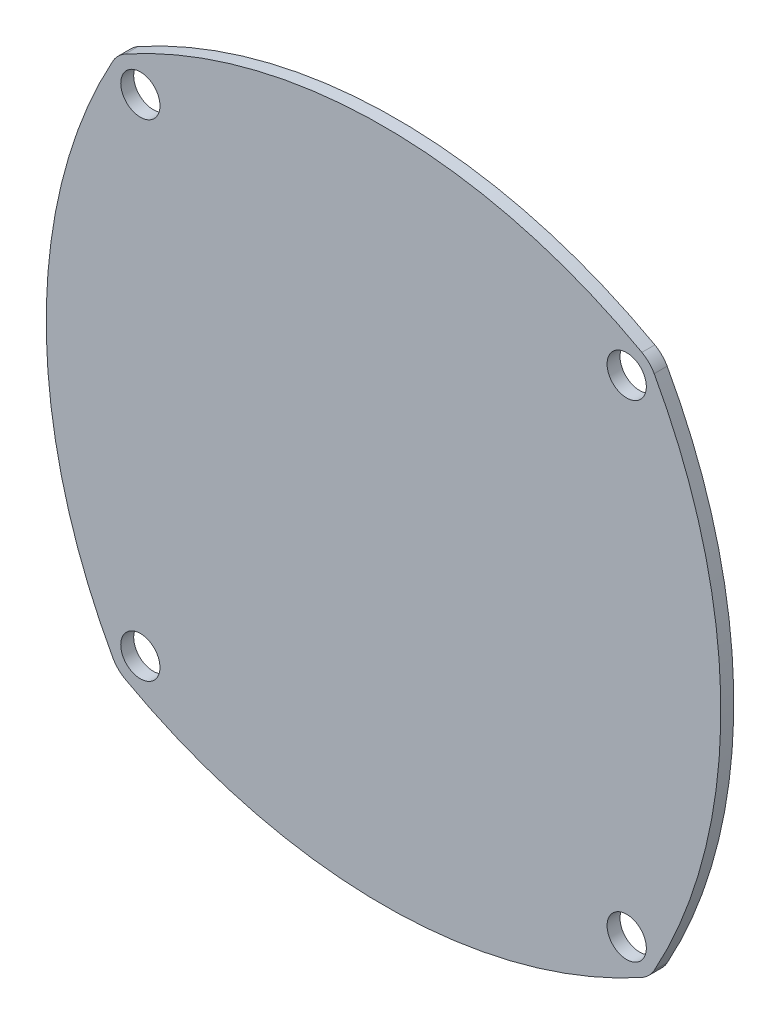
ISO-10303-21;
HEADER;
FILE_DESCRIPTION(('STEP AP214'),'2;1');
FILE_NAME('part.step','',(''),(''),'','','');
FILE_SCHEMA(('AUTOMOTIVE_DESIGN { 1 0 10303 214 1 1 1 1 }'));
ENDSEC;
DATA;
#1=APPLICATION_CONTEXT('core data for automotive mechanical design processes');
#2=APPLICATION_PROTOCOL_DEFINITION('international standard','automotive_design',2000,#1);
#3=PRODUCT_CONTEXT('',#1,'mechanical');
#4=PRODUCT('Part','Part','',(#3));
#5=PRODUCT_RELATED_PRODUCT_CATEGORY('part','',(#4));
#6=PRODUCT_DEFINITION_FORMATION('','',#4);
#7=PRODUCT_DEFINITION_CONTEXT('part definition',#1,'design');
#8=PRODUCT_DEFINITION('design','',#6,#7);
#9=PRODUCT_DEFINITION_SHAPE('','',#8);
#10=(LENGTH_UNIT() NAMED_UNIT(*) SI_UNIT(.MILLI.,.METRE.));
#11=(NAMED_UNIT(*) PLANE_ANGLE_UNIT() SI_UNIT($,.RADIAN.));
#12=(NAMED_UNIT(*) SI_UNIT($,.STERADIAN.) SOLID_ANGLE_UNIT());
#13=UNCERTAINTY_MEASURE_WITH_UNIT(LENGTH_MEASURE(1.E-05),#10,'distance_accuracy_value','');
#14=(GEOMETRIC_REPRESENTATION_CONTEXT(3) GLOBAL_UNCERTAINTY_ASSIGNED_CONTEXT((#13)) GLOBAL_UNIT_ASSIGNED_CONTEXT((#10,
#11,#12)) REPRESENTATION_CONTEXT('',''));
#15=CARTESIAN_POINT('',(0.,0.,0.));
#16=DIRECTION('',(0.,0.,1.));
#17=DIRECTION('',(1.,0.,0.));
#18=AXIS2_PLACEMENT_3D('',#15,#16,#17);
#19=CARTESIAN_POINT('',(0.,0.,0.));
#20=DIRECTION('',(0.,0.,1.));
#21=DIRECTION('',(1.,0.,0.));
#22=AXIS2_PLACEMENT_3D('',#19,#20,#21);
#23=PLANE('',#22);
#24=CARTESIAN_POINT('',(-31.,-31.,0.));
#25=DIRECTION('',(0.,0.,-1.));
#26=DIRECTION('',(-1.,0.,0.));
#27=AXIS2_PLACEMENT_3D('',#24,#25,#26);
#28=CIRCLE('',#27,2.5);
#29=CARTESIAN_POINT('',(-33.5,-31.,0.));
#30=VERTEX_POINT('',#29);
#31=EDGE_CURVE('E132',#30,#30,#28,.T.);
#32=ORIENTED_EDGE('',*,*,#31,.T.);
#33=EDGE_LOOP('',(#32));
#34=FACE_BOUND('',#33,.T.);
#35=CARTESIAN_POINT('',(31.,31.,0.));
#36=DIRECTION('',(0.,0.,-1.));
#37=DIRECTION('',(-1.,0.,0.));
#38=AXIS2_PLACEMENT_3D('',#35,#36,#37);
#39=CIRCLE('',#38,2.5);
#40=CARTESIAN_POINT('',(28.5,31.,0.));
#41=VERTEX_POINT('',#40);
#42=EDGE_CURVE('E135',#41,#41,#39,.T.);
#43=ORIENTED_EDGE('',*,*,#42,.T.);
#44=EDGE_LOOP('',(#43));
#45=FACE_BOUND('',#44,.T.);
#46=CARTESIAN_POINT('',(-31.,31.,0.));
#47=DIRECTION('',(0.,0.,-1.));
#48=DIRECTION('',(-1.,0.,0.));
#49=AXIS2_PLACEMENT_3D('',#46,#47,#48);
#50=CIRCLE('',#49,2.5);
#51=CARTESIAN_POINT('',(-33.5,31.,0.));
#52=VERTEX_POINT('',#51);
#53=EDGE_CURVE('E138',#52,#52,#50,.T.);
#54=ORIENTED_EDGE('',*,*,#53,.T.);
#55=EDGE_LOOP('',(#54));
#56=FACE_BOUND('',#55,.T.);
#57=CARTESIAN_POINT('',(31.,-31.,0.));
#58=DIRECTION('',(0.,0.,-1.));
#59=DIRECTION('',(-1.,0.,0.));
#60=AXIS2_PLACEMENT_3D('',#57,#58,#59);
#61=CIRCLE('',#60,2.5);
#62=CARTESIAN_POINT('',(28.5,-31.,0.));
#63=VERTEX_POINT('',#62);
#64=EDGE_CURVE('E141',#63,#63,#61,.T.);
#65=ORIENTED_EDGE('',*,*,#64,.T.);
#66=EDGE_LOOP('',(#65));
#67=FACE_BOUND('',#66,.T.);
#68=CARTESIAN_POINT('',(0.,25.1134950510145,0.));
#69=DIRECTION('',(0.,0.,-1.));
#70=DIRECTION('',(-1.,0.,0.));
#71=AXIS2_PLACEMENT_3D('',#68,#69,#70);
#72=CIRCLE('',#71,68.1134950510145);
#73=CARTESIAN_POINT('',(32.9390451953629,-34.5058601088865,0.));
#74=VERTEX_POINT('',#73);
#75=CARTESIAN_POINT('',(-32.9390451953628,-34.5058601088866,0.));
#76=VERTEX_POINT('',#75);
#77=EDGE_CURVE('E89',#74,#76,#72,.T.);
#78=ORIENTED_EDGE('',*,*,#77,.F.);
#79=CARTESIAN_POINT('',(31.0046828390813,-31.0046828390812,0.));
#80=DIRECTION('',(0.,0.,-1.));
#81=DIRECTION('',(-1.,0.,0.));
#82=AXIS2_PLACEMENT_3D('',#79,#80,#81);
#83=CIRCLE('',#82,4.);
#84=CARTESIAN_POINT('',(34.5058601088866,-32.9390451953628,0.));
#85=VERTEX_POINT('',#84);
#86=EDGE_CURVE('E85',#85,#74,#83,.T.);
#87=ORIENTED_EDGE('',*,*,#86,.F.);
#88=CARTESIAN_POINT('',(-25.1134950510148,0.,0.));
#89=DIRECTION('',(0.,0.,-1.));
#90=DIRECTION('',(-1.,0.,0.));
#91=AXIS2_PLACEMENT_3D('',#88,#89,#90);
#92=CIRCLE('',#91,68.1134950510147);
#93=CARTESIAN_POINT('',(34.5058601088866,32.9390451953629,0.));
#94=VERTEX_POINT('',#93);
#95=EDGE_CURVE('E20',#94,#85,#92,.T.);
#96=ORIENTED_EDGE('',*,*,#95,.F.);
#97=CARTESIAN_POINT('',(31.0046828390813,31.0046828390813,0.));
#98=DIRECTION('',(0.,0.,-1.));
#99=DIRECTION('',(-1.,0.,0.));
#100=AXIS2_PLACEMENT_3D('',#97,#98,#99);
#101=CIRCLE('',#100,4.);
#102=CARTESIAN_POINT('',(32.9390451953629,34.5058601088866,0.));
#103=VERTEX_POINT('',#102);
#104=EDGE_CURVE('E80',#103,#94,#101,.T.);
#105=ORIENTED_EDGE('',*,*,#104,.F.);
#106=CARTESIAN_POINT('',(0.,-25.1134950510145,0.));
#107=DIRECTION('',(0.,0.,-1.));
#108=DIRECTION('',(-1.,0.,0.));
#109=AXIS2_PLACEMENT_3D('',#106,#107,#108);
#110=CIRCLE('',#109,68.1134950510146);
#111=CARTESIAN_POINT('',(-32.9390451953628,34.5058601088866,0.));
#112=VERTEX_POINT('',#111);
#113=EDGE_CURVE('E155',#112,#103,#110,.T.);
#114=ORIENTED_EDGE('',*,*,#113,.F.);
#115=CARTESIAN_POINT('',(-31.0046828390813,31.0046828390813,0.));
#116=DIRECTION('',(0.,0.,-1.));
#117=DIRECTION('',(-1.,0.,0.));
#118=AXIS2_PLACEMENT_3D('',#115,#116,#117);
#119=CIRCLE('',#118,4.);
#120=CARTESIAN_POINT('',(-34.5058601088865,32.9390451953629,0.));
#121=VERTEX_POINT('',#120);
#122=EDGE_CURVE('E152',#121,#112,#119,.T.);
#123=ORIENTED_EDGE('',*,*,#122,.F.);
#124=CARTESIAN_POINT('',(25.1134950510144,0.,0.));
#125=DIRECTION('',(0.,0.,-1.));
#126=DIRECTION('',(-1.,0.,0.));
#127=AXIS2_PLACEMENT_3D('',#124,#125,#126);
#128=CIRCLE('',#127,68.1134950510144);
#129=CARTESIAN_POINT('',(-34.5058601088865,-32.9390451953629,0.));
#130=VERTEX_POINT('',#129);
#131=EDGE_CURVE('E148',#130,#121,#128,.T.);
#132=ORIENTED_EDGE('',*,*,#131,.F.);
#133=CARTESIAN_POINT('',(-31.0046828390813,-31.0046828390813,0.));
#134=DIRECTION('',(0.,0.,-1.));
#135=DIRECTION('',(-1.,0.,0.));
#136=AXIS2_PLACEMENT_3D('',#133,#134,#135);
#137=CIRCLE('',#136,4.);
#138=EDGE_CURVE('E145',#76,#130,#137,.T.);
#139=ORIENTED_EDGE('',*,*,#138,.F.);
#140=EDGE_LOOP('',(#78,#87,#96,#105,#114,#123,#132,#139));
#141=FACE_BOUND('',#140,.T.);
#142=ADVANCED_FACE('F16',(#34,#45,#56,#67,#141),#23,.T.);
#143=CARTESIAN_POINT('',(-25.1134950510148,0.,0.));
#144=DIRECTION('',(0.,0.,-1.));
#145=DIRECTION('',(-1.,0.,0.));
#146=AXIS2_PLACEMENT_3D('',#143,#144,#145);
#147=CYLINDRICAL_SURFACE('',#146,68.1134950510147);
#148=DIRECTION('',(0.,0.,-1.));
#149=VECTOR('',#148,1.);
#150=CARTESIAN_POINT('',(34.5058601088866,32.9390451953629,0.));
#151=LINE('',#150,#149);
#152=CARTESIAN_POINT('',(34.5058601088866,32.9390451953629,-1.65));
#153=VERTEX_POINT('',#152);
#154=EDGE_CURVE('E100',#94,#153,#151,.T.);
#155=ORIENTED_EDGE('',*,*,#154,.F.);
#156=ORIENTED_EDGE('',*,*,#95,.T.);
#157=DIRECTION('',(0.,0.,-1.));
#158=VECTOR('',#157,1.);
#159=CARTESIAN_POINT('',(34.5058601088866,-32.9390451953628,0.));
#160=LINE('',#159,#158);
#161=CARTESIAN_POINT('',(34.5058601088866,-32.9390451953628,-1.65));
#162=VERTEX_POINT('',#161);
#163=EDGE_CURVE('E99',#85,#162,#160,.T.);
#164=ORIENTED_EDGE('',*,*,#163,.T.);
#165=CARTESIAN_POINT('',(-25.1134950510148,0.,-1.65));
#166=DIRECTION('',(0.,0.,-1.));
#167=DIRECTION('',(-1.,0.,0.));
#168=AXIS2_PLACEMENT_3D('',#165,#166,#167);
#169=CIRCLE('',#168,68.1134950510147);
#170=EDGE_CURVE('E129',#162,#153,#169,.F.);
#171=ORIENTED_EDGE('',*,*,#170,.T.);
#172=EDGE_LOOP('',(#155,#156,#164,#171));
#173=FACE_BOUND('',#172,.T.);
#174=ADVANCED_FACE('F97',(#173),#147,.T.);
#175=CARTESIAN_POINT('',(31.0046828390813,31.0046828390813,0.));
#176=DIRECTION('',(0.,0.,-1.));
#177=DIRECTION('',(-1.,0.,0.));
#178=AXIS2_PLACEMENT_3D('',#175,#176,#177);
#179=CYLINDRICAL_SURFACE('',#178,4.);
#180=DIRECTION('',(0.,0.,-1.));
#181=VECTOR('',#180,1.);
#182=CARTESIAN_POINT('',(32.9390451953629,34.5058601088866,0.));
#183=LINE('',#182,#181);
#184=CARTESIAN_POINT('',(32.9390451953629,34.5058601088866,-1.65));
#185=VERTEX_POINT('',#184);
#186=EDGE_CURVE('E156',#103,#185,#183,.T.);
#187=ORIENTED_EDGE('',*,*,#186,.F.);
#188=ORIENTED_EDGE('',*,*,#104,.T.);
#189=ORIENTED_EDGE('',*,*,#154,.T.);
#190=CARTESIAN_POINT('',(31.0046828390813,31.0046828390813,-1.65));
#191=DIRECTION('',(0.,0.,-1.));
#192=DIRECTION('',(-1.,0.,0.));
#193=AXIS2_PLACEMENT_3D('',#190,#191,#192);
#194=CIRCLE('',#193,4.);
#195=EDGE_CURVE('E127',#153,#185,#194,.F.);
#196=ORIENTED_EDGE('',*,*,#195,.T.);
#197=EDGE_LOOP('',(#187,#188,#189,#196));
#198=FACE_BOUND('',#197,.T.);
#199=ADVANCED_FACE('F158',(#198),#179,.T.);
#200=CARTESIAN_POINT('',(0.,-25.1134950510145,0.));
#201=DIRECTION('',(0.,0.,-1.));
#202=DIRECTION('',(-1.,0.,0.));
#203=AXIS2_PLACEMENT_3D('',#200,#201,#202);
#204=CYLINDRICAL_SURFACE('',#203,68.1134950510146);
#205=ORIENTED_EDGE('',*,*,#186,.T.);
#206=CARTESIAN_POINT('',(0.,-25.1134950510145,-1.65));
#207=DIRECTION('',(0.,0.,-1.));
#208=DIRECTION('',(-1.,0.,0.));
#209=AXIS2_PLACEMENT_3D('',#206,#207,#208);
#210=CIRCLE('',#209,68.1134950510146);
#211=CARTESIAN_POINT('',(-32.9390451953628,34.5058601088866,-1.65));
#212=VERTEX_POINT('',#211);
#213=EDGE_CURVE('E124',#185,#212,#210,.F.);
#214=ORIENTED_EDGE('',*,*,#213,.T.);
#215=DIRECTION('',(0.,0.,-1.));
#216=VECTOR('',#215,1.);
#217=CARTESIAN_POINT('',(-32.9390451953628,34.5058601088866,0.));
#218=LINE('',#217,#216);
#219=EDGE_CURVE('E154',#112,#212,#218,.T.);
#220=ORIENTED_EDGE('',*,*,#219,.F.);
#221=ORIENTED_EDGE('',*,*,#113,.T.);
#222=EDGE_LOOP('',(#205,#214,#220,#221));
#223=FACE_BOUND('',#222,.T.);
#224=ADVANCED_FACE('F166',(#223),#204,.T.);
#225=CARTESIAN_POINT('',(-31.0046828390813,31.0046828390813,0.));
#226=DIRECTION('',(0.,0.,-1.));
#227=DIRECTION('',(-1.,0.,0.));
#228=AXIS2_PLACEMENT_3D('',#225,#226,#227);
#229=CYLINDRICAL_SURFACE('',#228,4.);
#230=DIRECTION('',(0.,0.,-1.));
#231=VECTOR('',#230,1.);
#232=CARTESIAN_POINT('',(-34.5058601088865,32.9390451953629,0.));
#233=LINE('',#232,#231);
#234=CARTESIAN_POINT('',(-34.5058601088865,32.9390451953629,-1.65));
#235=VERTEX_POINT('',#234);
#236=EDGE_CURVE('E151',#121,#235,#233,.T.);
#237=ORIENTED_EDGE('',*,*,#236,.F.);
#238=ORIENTED_EDGE('',*,*,#122,.T.);
#239=ORIENTED_EDGE('',*,*,#219,.T.);
#240=CARTESIAN_POINT('',(-31.0046828390813,31.0046828390813,-1.65));
#241=DIRECTION('',(0.,0.,-1.));
#242=DIRECTION('',(-1.,0.,0.));
#243=AXIS2_PLACEMENT_3D('',#240,#241,#242);
#244=CIRCLE('',#243,4.);
#245=EDGE_CURVE('E122',#212,#235,#244,.F.);
#246=ORIENTED_EDGE('',*,*,#245,.T.);
#247=EDGE_LOOP('',(#237,#238,#239,#246));
#248=FACE_BOUND('',#247,.T.);
#249=ADVANCED_FACE('F186',(#248),#229,.T.);
#250=CARTESIAN_POINT('',(25.1134950510144,0.,0.));
#251=DIRECTION('',(0.,0.,-1.));
#252=DIRECTION('',(-1.,0.,0.));
#253=AXIS2_PLACEMENT_3D('',#250,#251,#252);
#254=CYLINDRICAL_SURFACE('',#253,68.1134950510144);
#255=DIRECTION('',(0.,0.,-1.));
#256=VECTOR('',#255,1.);
#257=CARTESIAN_POINT('',(-34.5058601088865,-32.9390451953629,0.));
#258=LINE('',#257,#256);
#259=CARTESIAN_POINT('',(-34.5058601088865,-32.9390451953629,-1.65));
#260=VERTEX_POINT('',#259);
#261=EDGE_CURVE('E147',#130,#260,#258,.T.);
#262=ORIENTED_EDGE('',*,*,#261,.F.);
#263=ORIENTED_EDGE('',*,*,#131,.T.);
#264=ORIENTED_EDGE('',*,*,#236,.T.);
#265=CARTESIAN_POINT('',(25.1134950510144,0.,-1.65));
#266=DIRECTION('',(0.,0.,-1.));
#267=DIRECTION('',(-1.,0.,0.));
#268=AXIS2_PLACEMENT_3D('',#265,#266,#267);
#269=CIRCLE('',#268,68.1134950510144);
#270=EDGE_CURVE('E119',#235,#260,#269,.F.);
#271=ORIENTED_EDGE('',*,*,#270,.T.);
#272=EDGE_LOOP('',(#262,#263,#264,#271));
#273=FACE_BOUND('',#272,.T.);
#274=ADVANCED_FACE('F182',(#273),#254,.T.);
#275=CARTESIAN_POINT('',(-31.0046828390813,-31.0046828390813,0.));
#276=DIRECTION('',(0.,0.,-1.));
#277=DIRECTION('',(-1.,0.,0.));
#278=AXIS2_PLACEMENT_3D('',#275,#276,#277);
#279=CYLINDRICAL_SURFACE('',#278,4.);
#280=DIRECTION('',(0.,0.,-1.));
#281=VECTOR('',#280,1.);
#282=CARTESIAN_POINT('',(-32.9390451953628,-34.5058601088866,0.));
#283=LINE('',#282,#281);
#284=CARTESIAN_POINT('',(-32.9390451953628,-34.5058601088866,-1.65));
#285=VERTEX_POINT('',#284);
#286=EDGE_CURVE('E94',#76,#285,#283,.T.);
#287=ORIENTED_EDGE('',*,*,#286,.F.);
#288=ORIENTED_EDGE('',*,*,#138,.T.);
#289=ORIENTED_EDGE('',*,*,#261,.T.);
#290=CARTESIAN_POINT('',(-31.0046828390813,-31.0046828390813,-1.65));
#291=DIRECTION('',(0.,0.,-1.));
#292=DIRECTION('',(-1.,0.,0.));
#293=AXIS2_PLACEMENT_3D('',#290,#291,#292);
#294=CIRCLE('',#293,4.);
#295=EDGE_CURVE('E117',#260,#285,#294,.F.);
#296=ORIENTED_EDGE('',*,*,#295,.T.);
#297=EDGE_LOOP('',(#287,#288,#289,#296));
#298=FACE_BOUND('',#297,.T.);
#299=ADVANCED_FACE('F187',(#298),#279,.T.);
#300=CARTESIAN_POINT('',(0.,25.1134950510145,0.));
#301=DIRECTION('',(0.,0.,-1.));
#302=DIRECTION('',(-1.,0.,0.));
#303=AXIS2_PLACEMENT_3D('',#300,#301,#302);
#304=CYLINDRICAL_SURFACE('',#303,68.1134950510145);
#305=ORIENTED_EDGE('',*,*,#286,.T.);
#306=CARTESIAN_POINT('',(0.,25.1134950510145,-1.65));
#307=DIRECTION('',(0.,0.,-1.));
#308=DIRECTION('',(-1.,0.,0.));
#309=AXIS2_PLACEMENT_3D('',#306,#307,#308);
#310=CIRCLE('',#309,68.1134950510145);
#311=CARTESIAN_POINT('',(32.9390451953629,-34.5058601088865,-1.65));
#312=VERTEX_POINT('',#311);
#313=EDGE_CURVE('E114',#285,#312,#310,.F.);
#314=ORIENTED_EDGE('',*,*,#313,.T.);
#315=DIRECTION('',(0.,0.,-1.));
#316=VECTOR('',#315,1.);
#317=CARTESIAN_POINT('',(32.9390451953629,-34.5058601088865,0.));
#318=LINE('',#317,#316);
#319=EDGE_CURVE('E93',#74,#312,#318,.T.);
#320=ORIENTED_EDGE('',*,*,#319,.F.);
#321=ORIENTED_EDGE('',*,*,#77,.T.);
#322=EDGE_LOOP('',(#305,#314,#320,#321));
#323=FACE_BOUND('',#322,.T.);
#324=ADVANCED_FACE('F176',(#323),#304,.T.);
#325=CARTESIAN_POINT('',(31.0046828390813,-31.0046828390812,0.));
#326=DIRECTION('',(0.,0.,-1.));
#327=DIRECTION('',(-1.,0.,0.));
#328=AXIS2_PLACEMENT_3D('',#325,#326,#327);
#329=CYLINDRICAL_SURFACE('',#328,4.);
#330=ORIENTED_EDGE('',*,*,#319,.T.);
#331=CARTESIAN_POINT('',(31.0046828390813,-31.0046828390812,-1.65));
#332=DIRECTION('',(0.,0.,-1.));
#333=DIRECTION('',(-1.,0.,0.));
#334=AXIS2_PLACEMENT_3D('',#331,#332,#333);
#335=CIRCLE('',#334,4.);
#336=EDGE_CURVE('E35',#312,#162,#335,.F.);
#337=ORIENTED_EDGE('',*,*,#336,.T.);
#338=ORIENTED_EDGE('',*,*,#163,.F.);
#339=ORIENTED_EDGE('',*,*,#86,.T.);
#340=EDGE_LOOP('',(#330,#337,#338,#339));
#341=FACE_BOUND('',#340,.T.);
#342=ADVANCED_FACE('F101',(#341),#329,.T.);
#343=CARTESIAN_POINT('',(31.,-31.,0.));
#344=DIRECTION('',(0.,0.,-1.));
#345=DIRECTION('',(-1.,0.,0.));
#346=AXIS2_PLACEMENT_3D('',#343,#344,#345);
#347=CYLINDRICAL_SURFACE('',#346,2.5);
#348=CARTESIAN_POINT('',(31.,-31.,-1.65));
#349=DIRECTION('',(0.,0.,-1.));
#350=DIRECTION('',(-1.,0.,0.));
#351=AXIS2_PLACEMENT_3D('',#348,#349,#350);
#352=CIRCLE('',#351,2.5);
#353=CARTESIAN_POINT('',(28.5,-31.,-1.65));
#354=VERTEX_POINT('',#353);
#355=EDGE_CURVE('E111',#354,#354,#352,.T.);
#356=ORIENTED_EDGE('',*,*,#355,.T.);
#357=EDGE_LOOP('',(#356));
#358=FACE_BOUND('',#357,.T.);
#359=ORIENTED_EDGE('',*,*,#64,.F.);
#360=EDGE_LOOP('',(#359));
#361=FACE_BOUND('',#360,.T.);
#362=ADVANCED_FACE('F209',(#358,#361),#347,.F.);
#363=CARTESIAN_POINT('',(-31.,31.,0.));
#364=DIRECTION('',(0.,0.,-1.));
#365=DIRECTION('',(-1.,0.,0.));
#366=AXIS2_PLACEMENT_3D('',#363,#364,#365);
#367=CYLINDRICAL_SURFACE('',#366,2.5);
#368=CARTESIAN_POINT('',(-31.,31.,-1.65));
#369=DIRECTION('',(0.,0.,-1.));
#370=DIRECTION('',(-1.,0.,0.));
#371=AXIS2_PLACEMENT_3D('',#368,#369,#370);
#372=CIRCLE('',#371,2.5);
#373=CARTESIAN_POINT('',(-33.5,31.,-1.65));
#374=VERTEX_POINT('',#373);
#375=EDGE_CURVE('E108',#374,#374,#372,.T.);
#376=ORIENTED_EDGE('',*,*,#375,.T.);
#377=EDGE_LOOP('',(#376));
#378=FACE_BOUND('',#377,.T.);
#379=ORIENTED_EDGE('',*,*,#53,.F.);
#380=EDGE_LOOP('',(#379));
#381=FACE_BOUND('',#380,.T.);
#382=ADVANCED_FACE('F213',(#378,#381),#367,.F.);
#383=CARTESIAN_POINT('',(31.,31.,0.));
#384=DIRECTION('',(0.,0.,-1.));
#385=DIRECTION('',(-1.,0.,0.));
#386=AXIS2_PLACEMENT_3D('',#383,#384,#385);
#387=CYLINDRICAL_SURFACE('',#386,2.5);
#388=CARTESIAN_POINT('',(31.,31.,-1.65));
#389=DIRECTION('',(0.,0.,-1.));
#390=DIRECTION('',(-1.,0.,0.));
#391=AXIS2_PLACEMENT_3D('',#388,#389,#390);
#392=CIRCLE('',#391,2.5);
#393=CARTESIAN_POINT('',(28.5,31.,-1.65));
#394=VERTEX_POINT('',#393);
#395=EDGE_CURVE('E26',#394,#394,#392,.T.);
#396=ORIENTED_EDGE('',*,*,#395,.T.);
#397=EDGE_LOOP('',(#396));
#398=FACE_BOUND('',#397,.T.);
#399=ORIENTED_EDGE('',*,*,#42,.F.);
#400=EDGE_LOOP('',(#399));
#401=FACE_BOUND('',#400,.T.);
#402=ADVANCED_FACE('F203',(#398,#401),#387,.F.);
#403=CARTESIAN_POINT('',(-31.,-31.,0.));
#404=DIRECTION('',(0.,0.,-1.));
#405=DIRECTION('',(-1.,0.,0.));
#406=AXIS2_PLACEMENT_3D('',#403,#404,#405);
#407=CYLINDRICAL_SURFACE('',#406,2.5);
#408=CARTESIAN_POINT('',(-31.,-31.,-1.65));
#409=DIRECTION('',(0.,0.,-1.));
#410=DIRECTION('',(-1.,0.,0.));
#411=AXIS2_PLACEMENT_3D('',#408,#409,#410);
#412=CIRCLE('',#411,2.5);
#413=CARTESIAN_POINT('',(-33.5,-31.,-1.65));
#414=VERTEX_POINT('',#413);
#415=EDGE_CURVE('E11',#414,#414,#412,.T.);
#416=ORIENTED_EDGE('',*,*,#415,.T.);
#417=EDGE_LOOP('',(#416));
#418=FACE_BOUND('',#417,.T.);
#419=ORIENTED_EDGE('',*,*,#31,.F.);
#420=EDGE_LOOP('',(#419));
#421=FACE_BOUND('',#420,.T.);
#422=ADVANCED_FACE('F18',(#418,#421),#407,.F.);
#423=CARTESIAN_POINT('',(0.,0.,-1.65));
#424=DIRECTION('',(0.,0.,1.));
#425=DIRECTION('',(1.,0.,0.));
#426=AXIS2_PLACEMENT_3D('',#423,#424,#425);
#427=PLANE('',#426);
#428=ORIENTED_EDGE('',*,*,#415,.F.);
#429=EDGE_LOOP('',(#428));
#430=FACE_BOUND('',#429,.T.);
#431=ORIENTED_EDGE('',*,*,#395,.F.);
#432=EDGE_LOOP('',(#431));
#433=FACE_BOUND('',#432,.T.);
#434=ORIENTED_EDGE('',*,*,#375,.F.);
#435=EDGE_LOOP('',(#434));
#436=FACE_BOUND('',#435,.T.);
#437=ORIENTED_EDGE('',*,*,#355,.F.);
#438=EDGE_LOOP('',(#437));
#439=FACE_BOUND('',#438,.T.);
#440=ORIENTED_EDGE('',*,*,#313,.F.);
#441=ORIENTED_EDGE('',*,*,#295,.F.);
#442=ORIENTED_EDGE('',*,*,#270,.F.);
#443=ORIENTED_EDGE('',*,*,#245,.F.);
#444=ORIENTED_EDGE('',*,*,#213,.F.);
#445=ORIENTED_EDGE('',*,*,#195,.F.);
#446=ORIENTED_EDGE('',*,*,#170,.F.);
#447=ORIENTED_EDGE('',*,*,#336,.F.);
#448=EDGE_LOOP('',(#440,#441,#442,#443,#444,#445,#446,#447));
#449=FACE_BOUND('',#448,.T.);
#450=ADVANCED_FACE('F161',(#430,#433,#436,#439,#449),#427,.F.);
#451=CLOSED_SHELL('',(#142,#174,#199,#224,#249,#274,#299,#324,#342,#362,#382,#402,#422,#450));
#452=MANIFOLD_SOLID_BREP('B1',#451);
#453=ADVANCED_BREP_SHAPE_REPRESENTATION('',(#18,#452),#14);
#454=SHAPE_DEFINITION_REPRESENTATION(#9,#453);
ENDSEC;
END-ISO-10303-21;
